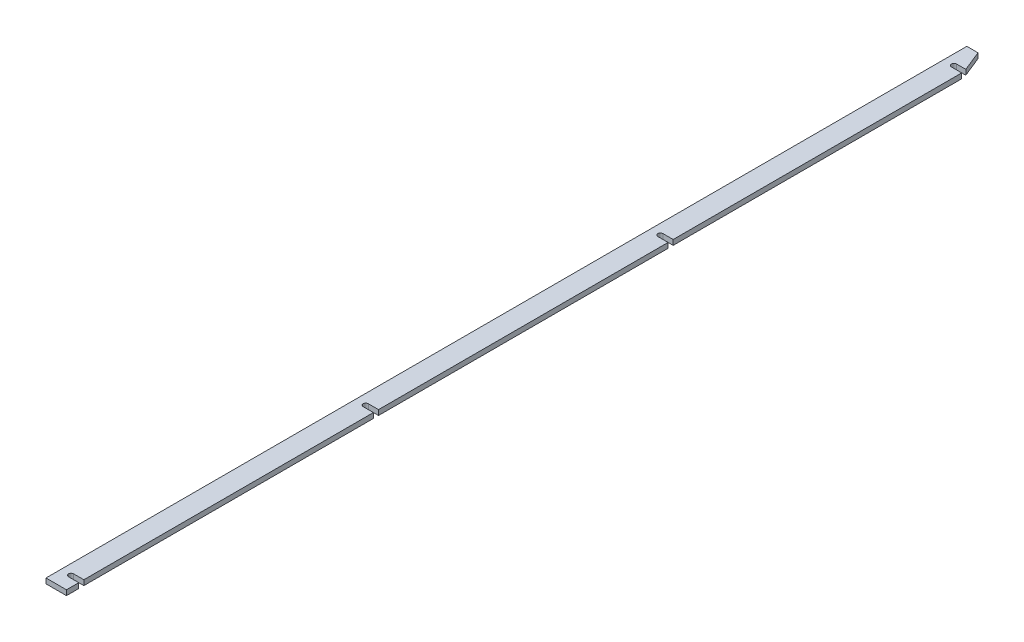
ISO-10303-21;
HEADER;
FILE_DESCRIPTION(('STEP AP214'),'2;1');
FILE_NAME('part.step','',(''),(''),'','','');
FILE_SCHEMA(('AUTOMOTIVE_DESIGN { 1 0 10303 214 1 1 1 1 }'));
ENDSEC;
DATA;
#1=APPLICATION_CONTEXT('core data for automotive mechanical design processes');
#2=APPLICATION_PROTOCOL_DEFINITION('international standard','automotive_design',2000,#1);
#3=PRODUCT_CONTEXT('',#1,'mechanical');
#4=PRODUCT('Part','Part','',(#3));
#5=PRODUCT_RELATED_PRODUCT_CATEGORY('part','',(#4));
#6=PRODUCT_DEFINITION_FORMATION('','',#4);
#7=PRODUCT_DEFINITION_CONTEXT('part definition',#1,'design');
#8=PRODUCT_DEFINITION('design','',#6,#7);
#9=PRODUCT_DEFINITION_SHAPE('','',#8);
#10=(LENGTH_UNIT() NAMED_UNIT(*) SI_UNIT(.MILLI.,.METRE.));
#11=(NAMED_UNIT(*) PLANE_ANGLE_UNIT() SI_UNIT($,.RADIAN.));
#12=(NAMED_UNIT(*) SI_UNIT($,.STERADIAN.) SOLID_ANGLE_UNIT());
#13=UNCERTAINTY_MEASURE_WITH_UNIT(LENGTH_MEASURE(1.E-05),#10,'distance_accuracy_value','');
#14=(GEOMETRIC_REPRESENTATION_CONTEXT(3) GLOBAL_UNCERTAINTY_ASSIGNED_CONTEXT((#13)) GLOBAL_UNIT_ASSIGNED_CONTEXT((#10,
#11,#12)) REPRESENTATION_CONTEXT('',''));
#15=CARTESIAN_POINT('',(0.,0.,0.));
#16=DIRECTION('',(0.,0.,1.));
#17=DIRECTION('',(1.,0.,0.));
#18=AXIS2_PLACEMENT_3D('',#15,#16,#17);
#19=CARTESIAN_POINT('',(3.17499999999999,1.5875,142.875));
#20=DIRECTION('',(-1.,0.,0.));
#21=DIRECTION('',(0.,0.,1.));
#22=AXIS2_PLACEMENT_3D('',#19,#20,#21);
#23=PLANE('',#22);
#24=DIRECTION('',(0.,0.,-1.));
#25=VECTOR('',#24,1.);
#26=CARTESIAN_POINT('',(3.17499999999999,0.,142.875));
#27=LINE('',#26,#25);
#28=CARTESIAN_POINT('',(3.17499999999999,0.,46.0375));
#29=VERTEX_POINT('',#28);
#30=CARTESIAN_POINT('',(3.17499999999999,0.,-43.815));
#31=VERTEX_POINT('',#30);
#32=EDGE_CURVE('E432',#29,#31,#27,.T.);
#33=ORIENTED_EDGE('',*,*,#32,.T.);
#34=DIRECTION('',(0.,1.,0.));
#35=VECTOR('',#34,1.);
#36=CARTESIAN_POINT('',(3.17499999999999,-0.000999999999999916,-43.815));
#37=LINE('',#36,#35);
#38=CARTESIAN_POINT('',(3.17499999999999,1.5875,-43.815));
#39=VERTEX_POINT('',#38);
#40=EDGE_CURVE('E244',#31,#39,#37,.T.);
#41=ORIENTED_EDGE('',*,*,#40,.T.);
#42=DIRECTION('',(0.,0.,-1.));
#43=VECTOR('',#42,1.);
#44=CARTESIAN_POINT('',(3.17499999999999,1.5875,142.875));
#45=LINE('',#44,#43);
#46=CARTESIAN_POINT('',(3.17499999999999,1.5875,46.0375));
#47=VERTEX_POINT('',#46);
#48=EDGE_CURVE('E423',#47,#39,#45,.T.);
#49=ORIENTED_EDGE('',*,*,#48,.F.);
#50=DIRECTION('',(0.,1.,0.));
#51=VECTOR('',#50,1.);
#52=CARTESIAN_POINT('',(3.17499999999999,-0.000999999999999916,46.0375));
#53=LINE('',#52,#51);
#54=EDGE_CURVE('E277',#29,#47,#53,.T.);
#55=ORIENTED_EDGE('',*,*,#54,.F.);
#56=EDGE_LOOP('',(#33,#41,#49,#55));
#57=FACE_BOUND('',#56,.T.);
#58=ADVANCED_FACE('F44',(#57),#23,.F.);
#59=CARTESIAN_POINT('',(3.17499999999999,0.,137.4775));
#60=VERTEX_POINT('',#59);
#61=CARTESIAN_POINT('',(3.17499999999999,0.,47.625));
#62=VERTEX_POINT('',#61);
#63=EDGE_CURVE('E348',#60,#62,#27,.T.);
#64=ORIENTED_EDGE('',*,*,#63,.T.);
#65=DIRECTION('',(0.,1.,0.));
#66=VECTOR('',#65,1.);
#67=CARTESIAN_POINT('',(3.17499999999999,-0.000999999999999916,47.625));
#68=LINE('',#67,#66);
#69=CARTESIAN_POINT('',(3.17499999999999,1.5875,47.625));
#70=VERTEX_POINT('',#69);
#71=EDGE_CURVE('E278',#62,#70,#68,.T.);
#72=ORIENTED_EDGE('',*,*,#71,.T.);
#73=CARTESIAN_POINT('',(3.17499999999999,1.5875,137.4775));
#74=VERTEX_POINT('',#73);
#75=EDGE_CURVE('E333',#74,#70,#45,.T.);
#76=ORIENTED_EDGE('',*,*,#75,.F.);
#77=DIRECTION('',(0.,1.,0.));
#78=VECTOR('',#77,1.);
#79=CARTESIAN_POINT('',(3.17499999999999,-0.000999999999999916,137.4775));
#80=LINE('',#79,#78);
#81=EDGE_CURVE('E311',#60,#74,#80,.T.);
#82=ORIENTED_EDGE('',*,*,#81,.F.);
#83=EDGE_LOOP('',(#64,#72,#76,#82));
#84=FACE_BOUND('',#83,.T.);
#85=ADVANCED_FACE('F421',(#84),#23,.F.);
#86=CARTESIAN_POINT('',(3.17499999999999,0.,142.875));
#87=VERTEX_POINT('',#86);
#88=CARTESIAN_POINT('',(3.17499999999999,0.,139.065));
#89=VERTEX_POINT('',#88);
#90=EDGE_CURVE('E343',#87,#89,#27,.T.);
#91=ORIENTED_EDGE('',*,*,#90,.T.);
#92=DIRECTION('',(0.,1.,0.));
#93=VECTOR('',#92,1.);
#94=CARTESIAN_POINT('',(3.17499999999999,-0.000999999999999916,139.065));
#95=LINE('',#94,#93);
#96=CARTESIAN_POINT('',(3.17499999999999,1.5875,139.065));
#97=VERTEX_POINT('',#96);
#98=EDGE_CURVE('E312',#89,#97,#95,.T.);
#99=ORIENTED_EDGE('',*,*,#98,.T.);
#100=CARTESIAN_POINT('',(3.17499999999999,1.5875,142.875));
#101=VERTEX_POINT('',#100);
#102=EDGE_CURVE('E328',#101,#97,#45,.T.);
#103=ORIENTED_EDGE('',*,*,#102,.F.);
#104=DIRECTION('',(0.,-1.,0.));
#105=VECTOR('',#104,1.);
#106=CARTESIAN_POINT('',(3.17499999999999,1.5875,142.875));
#107=LINE('',#106,#105);
#108=EDGE_CURVE('E342',#101,#87,#107,.T.);
#109=ORIENTED_EDGE('',*,*,#108,.T.);
#110=EDGE_LOOP('',(#91,#99,#103,#109));
#111=FACE_BOUND('',#110,.T.);
#112=ADVANCED_FACE('F401',(#111),#23,.F.);
#113=CARTESIAN_POINT('',(3.17499999999999,0.,-45.4025));
#114=VERTEX_POINT('',#113);
#115=CARTESIAN_POINT('',(3.17499999999999,0.,-134.9375));
#116=VERTEX_POINT('',#115);
#117=EDGE_CURVE('E327',#114,#116,#27,.T.);
#118=ORIENTED_EDGE('',*,*,#117,.T.);
#119=DIRECTION('',(0.,1.,0.));
#120=VECTOR('',#119,1.);
#121=CARTESIAN_POINT('',(3.17499999999999,-0.9525,-134.9375));
#122=LINE('',#121,#120);
#123=CARTESIAN_POINT('',(3.17499999999999,1.5875,-134.9375));
#124=VERTEX_POINT('',#123);
#125=EDGE_CURVE('E60',#116,#124,#122,.T.);
#126=ORIENTED_EDGE('',*,*,#125,.T.);
#127=CARTESIAN_POINT('',(3.17499999999999,1.5875,-45.4025));
#128=VERTEX_POINT('',#127);
#129=EDGE_CURVE('E206',#128,#124,#45,.T.);
#130=ORIENTED_EDGE('',*,*,#129,.F.);
#131=DIRECTION('',(0.,1.,0.));
#132=VECTOR('',#131,1.);
#133=CARTESIAN_POINT('',(3.17499999999999,-0.000999999999999916,-45.4025));
#134=LINE('',#133,#132);
#135=EDGE_CURVE('E243',#114,#128,#134,.T.);
#136=ORIENTED_EDGE('',*,*,#135,.F.);
#137=EDGE_LOOP('',(#118,#126,#130,#136));
#138=FACE_BOUND('',#137,.T.);
#139=ADVANCED_FACE('F46',(#138),#23,.F.);
#140=CARTESIAN_POINT('',(3.17499999999999,1.5875,-142.875));
#141=DIRECTION('',(0.,0.,1.));
#142=DIRECTION('',(1.,0.,0.));
#143=AXIS2_PLACEMENT_3D('',#140,#141,#142);
#144=PLANE('',#143);
#145=DIRECTION('',(-1.,0.,0.));
#146=VECTOR('',#145,1.);
#147=CARTESIAN_POINT('',(3.17499999999999,1.5875,-142.875));
#148=LINE('',#147,#146);
#149=CARTESIAN_POINT('',(0.290887270892746,1.5875,-142.875));
#150=VERTEX_POINT('',#149);
#151=CARTESIAN_POINT('',(-3.17500000000001,1.5875,-142.875));
#152=VERTEX_POINT('',#151);
#153=EDGE_CURVE('E332',#150,#152,#148,.T.);
#154=ORIENTED_EDGE('',*,*,#153,.F.);
#155=DIRECTION('',(0.,1.,0.));
#156=VECTOR('',#155,1.);
#157=CARTESIAN_POINT('',(0.290887270892746,-0.9525,-142.875));
#158=LINE('',#157,#156);
#159=CARTESIAN_POINT('',(0.290887270892746,0.,-142.875));
#160=VERTEX_POINT('',#159);
#161=EDGE_CURVE('E221',#160,#150,#158,.T.);
#162=ORIENTED_EDGE('',*,*,#161,.F.);
#163=DIRECTION('',(-1.,0.,0.));
#164=VECTOR('',#163,1.);
#165=CARTESIAN_POINT('',(3.17499999999999,0.,-142.875));
#166=LINE('',#165,#164);
#167=CARTESIAN_POINT('',(-3.17500000000001,0.,-142.875));
#168=VERTEX_POINT('',#167);
#169=EDGE_CURVE('E347',#160,#168,#166,.T.);
#170=ORIENTED_EDGE('',*,*,#169,.T.);
#171=DIRECTION('',(0.,-1.,0.));
#172=VECTOR('',#171,1.);
#173=CARTESIAN_POINT('',(-3.17500000000001,1.5875,-142.875));
#174=LINE('',#173,#172);
#175=EDGE_CURVE('E364',#152,#168,#174,.T.);
#176=ORIENTED_EDGE('',*,*,#175,.F.);
#177=EDGE_LOOP('',(#154,#162,#170,#176));
#178=FACE_BOUND('',#177,.T.);
#179=ADVANCED_FACE('F386',(#178),#144,.F.);
#180=CARTESIAN_POINT('',(-3.17500000000001,1.5875,142.875));
#181=DIRECTION('',(1.,0.,0.));
#182=DIRECTION('',(0.,0.,-1.));
#183=AXIS2_PLACEMENT_3D('',#180,#181,#182);
#184=PLANE('',#183);
#185=DIRECTION('',(0.,0.,1.));
#186=VECTOR('',#185,1.);
#187=CARTESIAN_POINT('',(-3.17500000000001,0.,142.875));
#188=LINE('',#187,#186);
#189=CARTESIAN_POINT('',(-3.17500000000001,0.,142.875));
#190=VERTEX_POINT('',#189);
#191=EDGE_CURVE('E351',#168,#190,#188,.T.);
#192=ORIENTED_EDGE('',*,*,#191,.T.);
#193=DIRECTION('',(0.,-1.,0.));
#194=VECTOR('',#193,1.);
#195=CARTESIAN_POINT('',(-3.17500000000001,1.5875,142.875));
#196=LINE('',#195,#194);
#197=CARTESIAN_POINT('',(-3.17500000000001,1.5875,142.875));
#198=VERTEX_POINT('',#197);
#199=EDGE_CURVE('E360',#198,#190,#196,.T.);
#200=ORIENTED_EDGE('',*,*,#199,.F.);
#201=DIRECTION('',(0.,0.,1.));
#202=VECTOR('',#201,1.);
#203=CARTESIAN_POINT('',(-3.17500000000001,1.5875,142.875));
#204=LINE('',#203,#202);
#205=EDGE_CURVE('E336',#152,#198,#204,.T.);
#206=ORIENTED_EDGE('',*,*,#205,.F.);
#207=ORIENTED_EDGE('',*,*,#175,.T.);
#208=EDGE_LOOP('',(#192,#200,#206,#207));
#209=FACE_BOUND('',#208,.T.);
#210=ADVANCED_FACE('F391',(#209),#184,.F.);
#211=CARTESIAN_POINT('',(3.17499999999999,1.5875,142.875));
#212=DIRECTION('',(0.,0.,-1.));
#213=DIRECTION('',(-1.,0.,0.));
#214=AXIS2_PLACEMENT_3D('',#211,#212,#213);
#215=PLANE('',#214);
#216=DIRECTION('',(1.,0.,0.));
#217=VECTOR('',#216,1.);
#218=CARTESIAN_POINT('',(3.17499999999999,0.,142.875));
#219=LINE('',#218,#217);
#220=EDGE_CURVE('E354',#190,#87,#219,.T.);
#221=ORIENTED_EDGE('',*,*,#220,.T.);
#222=ORIENTED_EDGE('',*,*,#108,.F.);
#223=DIRECTION('',(1.,0.,0.));
#224=VECTOR('',#223,1.);
#225=CARTESIAN_POINT('',(3.17499999999999,1.5875,142.875));
#226=LINE('',#225,#224);
#227=EDGE_CURVE('E339',#198,#101,#226,.T.);
#228=ORIENTED_EDGE('',*,*,#227,.F.);
#229=ORIENTED_EDGE('',*,*,#199,.T.);
#230=EDGE_LOOP('',(#221,#222,#228,#229));
#231=FACE_BOUND('',#230,.T.);
#232=ADVANCED_FACE('F397',(#231),#215,.F.);
#233=CARTESIAN_POINT('',(3.17499999999999,1.5875,-142.875));
#234=DIRECTION('',(0.,1.,0.));
#235=DIRECTION('',(0.,0.,1.));
#236=AXIS2_PLACEMENT_3D('',#233,#234,#235);
#237=PLANE('',#236);
#238=DIRECTION('',(0.374366709324985,0.,0.927280737937105));
#239=VECTOR('',#238,1.);
#240=CARTESIAN_POINT('',(0.290887270892746,1.5875,-142.875));
#241=LINE('',#240,#239);
#242=CARTESIAN_POINT('',(2.85454303009918,1.5875,-136.525));
#243=VERTEX_POINT('',#242);
#244=EDGE_CURVE('E208',#150,#243,#241,.T.);
#245=ORIENTED_EDGE('',*,*,#244,.F.);
#246=ORIENTED_EDGE('',*,*,#153,.T.);
#247=ORIENTED_EDGE('',*,*,#205,.T.);
#248=ORIENTED_EDGE('',*,*,#227,.T.);
#249=ORIENTED_EDGE('',*,*,#102,.T.);
#250=DIRECTION('',(1.,0.,0.));
#251=VECTOR('',#250,1.);
#252=CARTESIAN_POINT('',(3.17499999999999,1.5875,139.065));
#253=LINE('',#252,#251);
#254=CARTESIAN_POINT('',(0.,1.5875,139.065));
#255=VERTEX_POINT('',#254);
#256=EDGE_CURVE('E308',#255,#97,#253,.T.);
#257=ORIENTED_EDGE('',*,*,#256,.F.);
#258=CARTESIAN_POINT('',(0.,1.5875,138.27125));
#259=DIRECTION('',(0.,1.,0.));
#260=DIRECTION('',(0.,0.,-1.));
#261=AXIS2_PLACEMENT_3D('',#258,#259,#260);
#262=CIRCLE('',#261,0.793749999999996);
#263=CARTESIAN_POINT('',(0.,1.5875,137.4775));
#264=VERTEX_POINT('',#263);
#265=EDGE_CURVE('E304',#264,#255,#262,.T.);
#266=ORIENTED_EDGE('',*,*,#265,.F.);
#267=DIRECTION('',(-1.,0.,0.));
#268=VECTOR('',#267,1.);
#269=CARTESIAN_POINT('',(3.17499999999999,1.5875,137.4775));
#270=LINE('',#269,#268);
#271=EDGE_CURVE('E300',#74,#264,#270,.T.);
#272=ORIENTED_EDGE('',*,*,#271,.F.);
#273=ORIENTED_EDGE('',*,*,#75,.T.);
#274=DIRECTION('',(1.,0.,0.));
#275=VECTOR('',#274,1.);
#276=CARTESIAN_POINT('',(3.17499999999999,1.5875,47.625));
#277=LINE('',#276,#275);
#278=CARTESIAN_POINT('',(0.,1.5875,47.625));
#279=VERTEX_POINT('',#278);
#280=EDGE_CURVE('E274',#279,#70,#277,.T.);
#281=ORIENTED_EDGE('',*,*,#280,.F.);
#282=CARTESIAN_POINT('',(0.,1.5875,46.83125));
#283=DIRECTION('',(0.,1.,0.));
#284=DIRECTION('',(0.,0.,-1.));
#285=AXIS2_PLACEMENT_3D('',#282,#283,#284);
#286=CIRCLE('',#285,0.793749999999996);
#287=CARTESIAN_POINT('',(0.,1.5875,46.0375));
#288=VERTEX_POINT('',#287);
#289=EDGE_CURVE('E270',#288,#279,#286,.T.);
#290=ORIENTED_EDGE('',*,*,#289,.F.);
#291=DIRECTION('',(-1.,0.,0.));
#292=VECTOR('',#291,1.);
#293=CARTESIAN_POINT('',(3.17499999999999,1.5875,46.0375));
#294=LINE('',#293,#292);
#295=EDGE_CURVE('E266',#47,#288,#294,.T.);
#296=ORIENTED_EDGE('',*,*,#295,.F.);
#297=ORIENTED_EDGE('',*,*,#48,.T.);
#298=DIRECTION('',(1.,0.,0.));
#299=VECTOR('',#298,1.);
#300=CARTESIAN_POINT('',(3.17499999999999,1.5875,-43.815));
#301=LINE('',#300,#299);
#302=CARTESIAN_POINT('',(0.,1.5875,-43.815));
#303=VERTEX_POINT('',#302);
#304=EDGE_CURVE('E240',#303,#39,#301,.T.);
#305=ORIENTED_EDGE('',*,*,#304,.F.);
#306=CARTESIAN_POINT('',(0.,1.5875,-44.60875));
#307=DIRECTION('',(0.,1.,0.));
#308=DIRECTION('',(0.,0.,-1.));
#309=AXIS2_PLACEMENT_3D('',#306,#307,#308);
#310=CIRCLE('',#309,0.793749999999996);
#311=CARTESIAN_POINT('',(0.,1.5875,-45.4025));
#312=VERTEX_POINT('',#311);
#313=EDGE_CURVE('E236',#312,#303,#310,.T.);
#314=ORIENTED_EDGE('',*,*,#313,.F.);
#315=DIRECTION('',(-1.,0.,0.));
#316=VECTOR('',#315,1.);
#317=CARTESIAN_POINT('',(3.17499999999999,1.5875,-45.4025));
#318=LINE('',#317,#316);
#319=EDGE_CURVE('E232',#128,#312,#318,.T.);
#320=ORIENTED_EDGE('',*,*,#319,.F.);
#321=ORIENTED_EDGE('',*,*,#129,.T.);
#322=DIRECTION('',(1.,0.,0.));
#323=VECTOR('',#322,1.);
#324=CARTESIAN_POINT('',(0.,1.5875,-134.9375));
#325=LINE('',#324,#323);
#326=CARTESIAN_POINT('',(0.,1.5875,-134.9375));
#327=VERTEX_POINT('',#326);
#328=EDGE_CURVE('E184',#327,#124,#325,.T.);
#329=ORIENTED_EDGE('',*,*,#328,.F.);
#330=CARTESIAN_POINT('',(0.,1.5875,-135.73125));
#331=DIRECTION('',(0.,1.,0.));
#332=DIRECTION('',(0.,0.,1.));
#333=AXIS2_PLACEMENT_3D('',#330,#331,#332);
#334=CIRCLE('',#333,0.793749999999996);
#335=CARTESIAN_POINT('',(0.,1.5875,-136.525));
#336=VERTEX_POINT('',#335);
#337=EDGE_CURVE('E192',#336,#327,#334,.T.);
#338=ORIENTED_EDGE('',*,*,#337,.F.);
#339=DIRECTION('',(-1.,0.,0.));
#340=VECTOR('',#339,1.);
#341=CARTESIAN_POINT('',(2.85454303009918,1.5875,-136.525));
#342=LINE('',#341,#340);
#343=EDGE_CURVE('E189',#243,#336,#342,.T.);
#344=ORIENTED_EDGE('',*,*,#343,.F.);
#345=EDGE_LOOP('',(#245,#246,#247,#248,#249,#257,#266,#272,#273,#281,#290,#296,#297,#305,#314,
#320,#321,#329,#338,#344));
#346=FACE_BOUND('',#345,.T.);
#347=ADVANCED_FACE('F203',(#346),#237,.T.);
#348=CARTESIAN_POINT('',(3.17499999999999,0.,-142.875));
#349=DIRECTION('',(0.,1.,0.));
#350=DIRECTION('',(0.,0.,1.));
#351=AXIS2_PLACEMENT_3D('',#348,#349,#350);
#352=PLANE('',#351);
#353=ORIENTED_EDGE('',*,*,#169,.F.);
#354=DIRECTION('',(0.374366709324985,0.,0.927280737937105));
#355=VECTOR('',#354,1.);
#356=CARTESIAN_POINT('',(0.695096918844503,0.,-141.873800343893));
#357=LINE('',#356,#355);
#358=CARTESIAN_POINT('',(2.85454303009918,0.,-136.525));
#359=VERTEX_POINT('',#358);
#360=EDGE_CURVE('E11',#160,#359,#357,.T.);
#361=ORIENTED_EDGE('',*,*,#360,.T.);
#362=DIRECTION('',(-1.,0.,0.));
#363=VECTOR('',#362,1.);
#364=CARTESIAN_POINT('',(3.17499999999999,0.,-136.525));
#365=LINE('',#364,#363);
#366=CARTESIAN_POINT('',(0.,0.,-136.525));
#367=VERTEX_POINT('',#366);
#368=EDGE_CURVE('E53',#359,#367,#365,.T.);
#369=ORIENTED_EDGE('',*,*,#368,.T.);
#370=CARTESIAN_POINT('',(0.,0.,-135.73125));
#371=DIRECTION('',(0.,1.,0.));
#372=DIRECTION('',(0.,0.,1.));
#373=AXIS2_PLACEMENT_3D('',#370,#371,#372);
#374=CIRCLE('',#373,0.793749999999996);
#375=CARTESIAN_POINT('',(0.,0.,-134.9375));
#376=VERTEX_POINT('',#375);
#377=EDGE_CURVE('E370',#367,#376,#374,.T.);
#378=ORIENTED_EDGE('',*,*,#377,.T.);
#379=DIRECTION('',(1.,0.,0.));
#380=VECTOR('',#379,1.);
#381=CARTESIAN_POINT('',(3.17499999999999,0.,-134.9375));
#382=LINE('',#381,#380);
#383=EDGE_CURVE('E185',#376,#116,#382,.T.);
#384=ORIENTED_EDGE('',*,*,#383,.T.);
#385=ORIENTED_EDGE('',*,*,#117,.F.);
#386=DIRECTION('',(1.,0.,0.));
#387=VECTOR('',#386,1.);
#388=CARTESIAN_POINT('',(3.17499999999999,0.,-45.4025));
#389=LINE('',#388,#387);
#390=CARTESIAN_POINT('',(0.,0.,-45.4025));
#391=VERTEX_POINT('',#390);
#392=EDGE_CURVE('E248',#391,#114,#389,.T.);
#393=ORIENTED_EDGE('',*,*,#392,.F.);
#394=CARTESIAN_POINT('',(0.,0.,-44.60875));
#395=DIRECTION('',(0.,1.,0.));
#396=DIRECTION('',(0.,0.,1.));
#397=AXIS2_PLACEMENT_3D('',#394,#395,#396);
#398=CIRCLE('',#397,0.793749999999996);
#399=CARTESIAN_POINT('',(0.,0.,-43.815));
#400=VERTEX_POINT('',#399);
#401=EDGE_CURVE('E68',#400,#391,#398,.F.);
#402=ORIENTED_EDGE('',*,*,#401,.F.);
#403=DIRECTION('',(-1.,0.,0.));
#404=VECTOR('',#403,1.);
#405=CARTESIAN_POINT('',(3.17499999999999,0.,-43.815));
#406=LINE('',#405,#404);
#407=EDGE_CURVE('E228',#31,#400,#406,.T.);
#408=ORIENTED_EDGE('',*,*,#407,.F.);
#409=ORIENTED_EDGE('',*,*,#32,.F.);
#410=DIRECTION('',(1.,0.,0.));
#411=VECTOR('',#410,1.);
#412=CARTESIAN_POINT('',(3.17499999999999,0.,46.0375));
#413=LINE('',#412,#411);
#414=CARTESIAN_POINT('',(0.,0.,46.0375));
#415=VERTEX_POINT('',#414);
#416=EDGE_CURVE('E282',#415,#29,#413,.T.);
#417=ORIENTED_EDGE('',*,*,#416,.F.);
#418=CARTESIAN_POINT('',(0.,0.,46.83125));
#419=DIRECTION('',(0.,1.,0.));
#420=DIRECTION('',(0.,0.,1.));
#421=AXIS2_PLACEMENT_3D('',#418,#419,#420);
#422=CIRCLE('',#421,0.793749999999996);
#423=CARTESIAN_POINT('',(0.,0.,47.625));
#424=VERTEX_POINT('',#423);
#425=EDGE_CURVE('E259',#424,#415,#422,.F.);
#426=ORIENTED_EDGE('',*,*,#425,.F.);
#427=DIRECTION('',(-1.,0.,0.));
#428=VECTOR('',#427,1.);
#429=CARTESIAN_POINT('',(3.17499999999999,0.,47.625));
#430=LINE('',#429,#428);
#431=EDGE_CURVE('E262',#62,#424,#430,.T.);
#432=ORIENTED_EDGE('',*,*,#431,.F.);
#433=ORIENTED_EDGE('',*,*,#63,.F.);
#434=DIRECTION('',(1.,0.,0.));
#435=VECTOR('',#434,1.);
#436=CARTESIAN_POINT('',(3.17499999999999,0.,137.4775));
#437=LINE('',#436,#435);
#438=CARTESIAN_POINT('',(0.,0.,137.4775));
#439=VERTEX_POINT('',#438);
#440=EDGE_CURVE('E316',#439,#60,#437,.T.);
#441=ORIENTED_EDGE('',*,*,#440,.F.);
#442=CARTESIAN_POINT('',(0.,0.,138.27125));
#443=DIRECTION('',(0.,1.,0.));
#444=DIRECTION('',(0.,0.,1.));
#445=AXIS2_PLACEMENT_3D('',#442,#443,#444);
#446=CIRCLE('',#445,0.793749999999996);
#447=CARTESIAN_POINT('',(0.,0.,139.065));
#448=VERTEX_POINT('',#447);
#449=EDGE_CURVE('E293',#448,#439,#446,.F.);
#450=ORIENTED_EDGE('',*,*,#449,.F.);
#451=DIRECTION('',(-1.,0.,0.));
#452=VECTOR('',#451,1.);
#453=CARTESIAN_POINT('',(3.17499999999999,0.,139.065));
#454=LINE('',#453,#452);
#455=EDGE_CURVE('E296',#89,#448,#454,.T.);
#456=ORIENTED_EDGE('',*,*,#455,.F.);
#457=ORIENTED_EDGE('',*,*,#90,.F.);
#458=ORIENTED_EDGE('',*,*,#220,.F.);
#459=ORIENTED_EDGE('',*,*,#191,.F.);
#460=EDGE_LOOP('',(#353,#361,#369,#378,#384,#385,#393,#402,#408,#409,#417,#426,#432,#433,#441,
#450,#456,#457,#458,#459));
#461=FACE_BOUND('',#460,.T.);
#462=ADVANCED_FACE('F376',(#461),#352,.F.);
#463=CARTESIAN_POINT('',(3.17499999999999,-0.000999999999999916,139.065));
#464=DIRECTION('',(0.,0.,1.));
#465=DIRECTION('',(1.,0.,0.));
#466=AXIS2_PLACEMENT_3D('',#463,#464,#465);
#467=PLANE('',#466);
#468=ORIENTED_EDGE('',*,*,#455,.T.);
#469=DIRECTION('',(0.,1.,0.));
#470=VECTOR('',#469,1.);
#471=CARTESIAN_POINT('',(0.,-0.000999999999999916,139.065));
#472=LINE('',#471,#470);
#473=EDGE_CURVE('E317',#448,#255,#472,.T.);
#474=ORIENTED_EDGE('',*,*,#473,.T.);
#475=ORIENTED_EDGE('',*,*,#256,.T.);
#476=ORIENTED_EDGE('',*,*,#98,.F.);
#477=EDGE_LOOP('',(#468,#474,#475,#476));
#478=FACE_BOUND('',#477,.T.);
#479=ADVANCED_FACE('F404',(#478),#467,.F.);
#480=CARTESIAN_POINT('',(0.,-0.000999999999999916,138.27125));
#481=DIRECTION('',(0.,1.,0.));
#482=DIRECTION('',(0.,0.,1.));
#483=AXIS2_PLACEMENT_3D('',#480,#481,#482);
#484=CYLINDRICAL_SURFACE('',#483,0.793749999999996);
#485=ORIENTED_EDGE('',*,*,#449,.T.);
#486=DIRECTION('',(0.,1.,0.));
#487=VECTOR('',#486,1.);
#488=CARTESIAN_POINT('',(0.,-0.000999999999999916,137.4775));
#489=LINE('',#488,#487);
#490=EDGE_CURVE('E320',#439,#264,#489,.T.);
#491=ORIENTED_EDGE('',*,*,#490,.T.);
#492=ORIENTED_EDGE('',*,*,#265,.T.);
#493=ORIENTED_EDGE('',*,*,#473,.F.);
#494=EDGE_LOOP('',(#485,#491,#492,#493));
#495=FACE_BOUND('',#494,.T.);
#496=ADVANCED_FACE('F410',(#495),#484,.F.);
#497=CARTESIAN_POINT('',(3.17499999999999,-0.000999999999999916,137.4775));
#498=DIRECTION('',(0.,0.,-1.));
#499=DIRECTION('',(-1.,0.,0.));
#500=AXIS2_PLACEMENT_3D('',#497,#498,#499);
#501=PLANE('',#500);
#502=ORIENTED_EDGE('',*,*,#440,.T.);
#503=ORIENTED_EDGE('',*,*,#81,.T.);
#504=ORIENTED_EDGE('',*,*,#271,.T.);
#505=ORIENTED_EDGE('',*,*,#490,.F.);
#506=EDGE_LOOP('',(#502,#503,#504,#505));
#507=FACE_BOUND('',#506,.T.);
#508=ADVANCED_FACE('F412',(#507),#501,.F.);
#509=CARTESIAN_POINT('',(3.17499999999999,-0.000999999999999916,47.625));
#510=DIRECTION('',(0.,0.,1.));
#511=DIRECTION('',(1.,0.,0.));
#512=AXIS2_PLACEMENT_3D('',#509,#510,#511);
#513=PLANE('',#512);
#514=ORIENTED_EDGE('',*,*,#431,.T.);
#515=DIRECTION('',(0.,1.,0.));
#516=VECTOR('',#515,1.);
#517=CARTESIAN_POINT('',(0.,-0.000999999999999916,47.625));
#518=LINE('',#517,#516);
#519=EDGE_CURVE('E283',#424,#279,#518,.T.);
#520=ORIENTED_EDGE('',*,*,#519,.T.);
#521=ORIENTED_EDGE('',*,*,#280,.T.);
#522=ORIENTED_EDGE('',*,*,#71,.F.);
#523=EDGE_LOOP('',(#514,#520,#521,#522));
#524=FACE_BOUND('',#523,.T.);
#525=ADVANCED_FACE('F460',(#524),#513,.F.);
#526=CARTESIAN_POINT('',(0.,-0.000999999999999916,46.83125));
#527=DIRECTION('',(0.,1.,0.));
#528=DIRECTION('',(0.,0.,1.));
#529=AXIS2_PLACEMENT_3D('',#526,#527,#528);
#530=CYLINDRICAL_SURFACE('',#529,0.793749999999996);
#531=ORIENTED_EDGE('',*,*,#425,.T.);
#532=DIRECTION('',(0.,1.,0.));
#533=VECTOR('',#532,1.);
#534=CARTESIAN_POINT('',(0.,-0.000999999999999916,46.0375));
#535=LINE('',#534,#533);
#536=EDGE_CURVE('E286',#415,#288,#535,.T.);
#537=ORIENTED_EDGE('',*,*,#536,.T.);
#538=ORIENTED_EDGE('',*,*,#289,.T.);
#539=ORIENTED_EDGE('',*,*,#519,.F.);
#540=EDGE_LOOP('',(#531,#537,#538,#539));
#541=FACE_BOUND('',#540,.T.);
#542=ADVANCED_FACE('F458',(#541),#530,.F.);
#543=CARTESIAN_POINT('',(3.17499999999999,-0.000999999999999916,46.0375));
#544=DIRECTION('',(0.,0.,-1.));
#545=DIRECTION('',(-1.,0.,0.));
#546=AXIS2_PLACEMENT_3D('',#543,#544,#545);
#547=PLANE('',#546);
#548=ORIENTED_EDGE('',*,*,#416,.T.);
#549=ORIENTED_EDGE('',*,*,#54,.T.);
#550=ORIENTED_EDGE('',*,*,#295,.T.);
#551=ORIENTED_EDGE('',*,*,#536,.F.);
#552=EDGE_LOOP('',(#548,#549,#550,#551));
#553=FACE_BOUND('',#552,.T.);
#554=ADVANCED_FACE('F455',(#553),#547,.F.);
#555=CARTESIAN_POINT('',(3.17499999999999,-0.000999999999999916,-43.815));
#556=DIRECTION('',(0.,0.,1.));
#557=DIRECTION('',(1.,0.,0.));
#558=AXIS2_PLACEMENT_3D('',#555,#556,#557);
#559=PLANE('',#558);
#560=ORIENTED_EDGE('',*,*,#407,.T.);
#561=DIRECTION('',(0.,1.,0.));
#562=VECTOR('',#561,1.);
#563=CARTESIAN_POINT('',(0.,-0.000999999999999916,-43.815));
#564=LINE('',#563,#562);
#565=EDGE_CURVE('E249',#400,#303,#564,.T.);
#566=ORIENTED_EDGE('',*,*,#565,.T.);
#567=ORIENTED_EDGE('',*,*,#304,.T.);
#568=ORIENTED_EDGE('',*,*,#40,.F.);
#569=EDGE_LOOP('',(#560,#566,#567,#568));
#570=FACE_BOUND('',#569,.T.);
#571=ADVANCED_FACE('F446',(#570),#559,.F.);
#572=CARTESIAN_POINT('',(0.,-0.000999999999999916,-44.60875));
#573=DIRECTION('',(0.,1.,0.));
#574=DIRECTION('',(0.,0.,1.));
#575=AXIS2_PLACEMENT_3D('',#572,#573,#574);
#576=CYLINDRICAL_SURFACE('',#575,0.793749999999996);
#577=ORIENTED_EDGE('',*,*,#401,.T.);
#578=DIRECTION('',(0.,1.,0.));
#579=VECTOR('',#578,1.);
#580=CARTESIAN_POINT('',(0.,-0.000999999999999916,-45.4025));
#581=LINE('',#580,#579);
#582=EDGE_CURVE('E252',#391,#312,#581,.T.);
#583=ORIENTED_EDGE('',*,*,#582,.T.);
#584=ORIENTED_EDGE('',*,*,#313,.T.);
#585=ORIENTED_EDGE('',*,*,#565,.F.);
#586=EDGE_LOOP('',(#577,#583,#584,#585));
#587=FACE_BOUND('',#586,.T.);
#588=ADVANCED_FACE('F444',(#587),#576,.F.);
#589=CARTESIAN_POINT('',(3.17499999999999,-0.000999999999999916,-45.4025));
#590=DIRECTION('',(0.,0.,-1.));
#591=DIRECTION('',(-1.,0.,0.));
#592=AXIS2_PLACEMENT_3D('',#589,#590,#591);
#593=PLANE('',#592);
#594=ORIENTED_EDGE('',*,*,#392,.T.);
#595=ORIENTED_EDGE('',*,*,#135,.T.);
#596=ORIENTED_EDGE('',*,*,#319,.T.);
#597=ORIENTED_EDGE('',*,*,#582,.F.);
#598=EDGE_LOOP('',(#594,#595,#596,#597));
#599=FACE_BOUND('',#598,.T.);
#600=ADVANCED_FACE('F442',(#599),#593,.F.);
#601=CARTESIAN_POINT('',(0.,-0.9525,-135.73125));
#602=DIRECTION('',(0.,1.,0.));
#603=DIRECTION('',(0.,0.,1.));
#604=AXIS2_PLACEMENT_3D('',#601,#602,#603);
#605=CYLINDRICAL_SURFACE('',#604,0.793749999999996);
#606=DIRECTION('',(0.,1.,0.));
#607=VECTOR('',#606,1.);
#608=CARTESIAN_POINT('',(0.,-0.9525,-136.525));
#609=LINE('',#608,#607);
#610=EDGE_CURVE('E195',#367,#336,#609,.T.);
#611=ORIENTED_EDGE('',*,*,#610,.T.);
#612=ORIENTED_EDGE('',*,*,#337,.T.);
#613=DIRECTION('',(0.,1.,0.));
#614=VECTOR('',#613,1.);
#615=CARTESIAN_POINT('',(0.,-0.9525,-134.9375));
#616=LINE('',#615,#614);
#617=EDGE_CURVE('E180',#376,#327,#616,.T.);
#618=ORIENTED_EDGE('',*,*,#617,.F.);
#619=ORIENTED_EDGE('',*,*,#377,.F.);
#620=EDGE_LOOP('',(#611,#612,#618,#619));
#621=FACE_BOUND('',#620,.T.);
#622=ADVANCED_FACE('F193',(#621),#605,.F.);
#623=CARTESIAN_POINT('',(2.85454303009918,-0.9525,-136.525));
#624=DIRECTION('',(0.,0.,-1.));
#625=DIRECTION('',(-1.,0.,0.));
#626=AXIS2_PLACEMENT_3D('',#623,#624,#625);
#627=PLANE('',#626);
#628=DIRECTION('',(0.,1.,0.));
#629=VECTOR('',#628,1.);
#630=CARTESIAN_POINT('',(2.85454303009918,-0.9525,-136.525));
#631=LINE('',#630,#629);
#632=EDGE_CURVE('E218',#359,#243,#631,.T.);
#633=ORIENTED_EDGE('',*,*,#632,.T.);
#634=ORIENTED_EDGE('',*,*,#343,.T.);
#635=ORIENTED_EDGE('',*,*,#610,.F.);
#636=ORIENTED_EDGE('',*,*,#368,.F.);
#637=EDGE_LOOP('',(#633,#634,#635,#636));
#638=FACE_BOUND('',#637,.T.);
#639=ADVANCED_FACE('F379',(#638),#627,.F.);
#640=CARTESIAN_POINT('',(0.290887270892746,-0.9525,-142.875));
#641=DIRECTION('',(-0.927280737937105,0.,0.374366709324985));
#642=DIRECTION('',(0.374366709324985,0.,0.927280737937105));
#643=AXIS2_PLACEMENT_3D('',#640,#641,#642);
#644=PLANE('',#643);
#645=ORIENTED_EDGE('',*,*,#161,.T.);
#646=ORIENTED_EDGE('',*,*,#244,.T.);
#647=ORIENTED_EDGE('',*,*,#632,.F.);
#648=ORIENTED_EDGE('',*,*,#360,.F.);
#649=EDGE_LOOP('',(#645,#646,#647,#648));
#650=FACE_BOUND('',#649,.T.);
#651=ADVANCED_FACE('F381',(#650),#644,.F.);
#652=CARTESIAN_POINT('',(0.,-0.9525,-134.9375));
#653=DIRECTION('',(0.,0.,1.));
#654=DIRECTION('',(1.,0.,0.));
#655=AXIS2_PLACEMENT_3D('',#652,#653,#654);
#656=PLANE('',#655);
#657=ORIENTED_EDGE('',*,*,#617,.T.);
#658=ORIENTED_EDGE('',*,*,#328,.T.);
#659=ORIENTED_EDGE('',*,*,#125,.F.);
#660=ORIENTED_EDGE('',*,*,#383,.F.);
#661=EDGE_LOOP('',(#657,#658,#659,#660));
#662=FACE_BOUND('',#661,.T.);
#663=ADVANCED_FACE('F182',(#662),#656,.F.);
#664=CLOSED_SHELL('',(#58,#85,#112,#139,#179,#210,#232,#347,#462,#479,#496,#508,#525,#542,#554,
#571,#588,#600,#622,#639,#651,#663));
#665=MANIFOLD_SOLID_BREP('B2',#664);
#666=ADVANCED_BREP_SHAPE_REPRESENTATION('',(#18,#665),#14);
#667=SHAPE_DEFINITION_REPRESENTATION(#9,#666);
ENDSEC;
END-ISO-10303-21;
